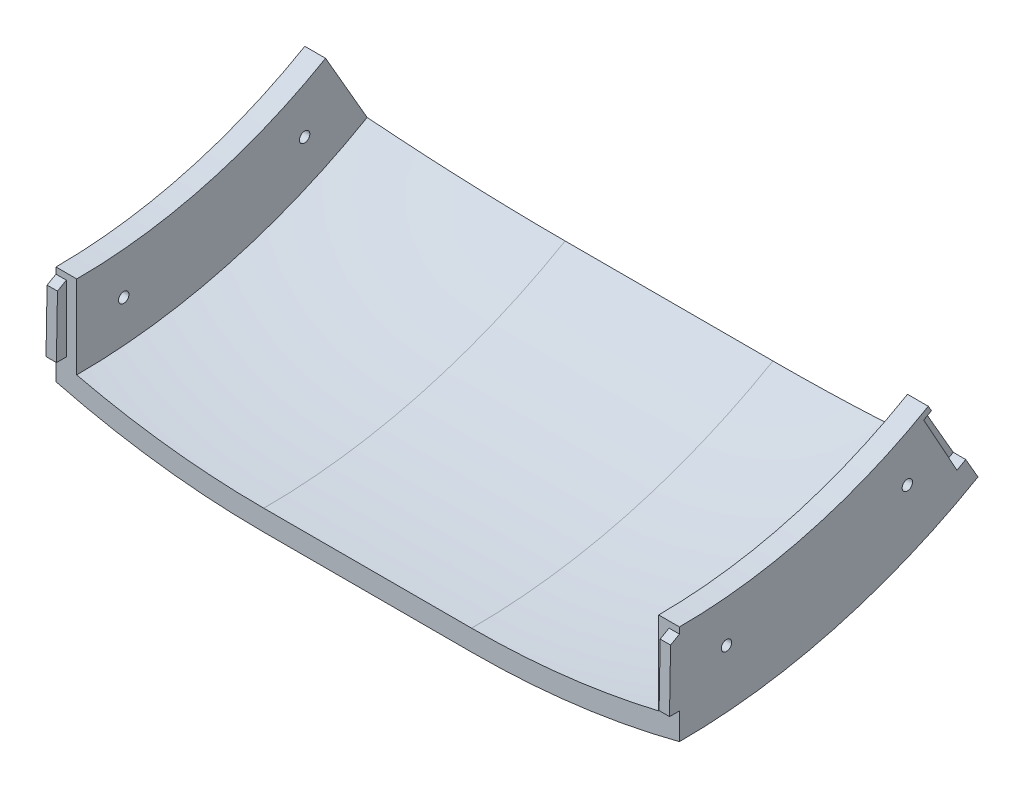
ISO-10303-21;
HEADER;
FILE_DESCRIPTION(('STEP AP214'),'2;1');
FILE_NAME('part.step','',(''),(''),'','','');
FILE_SCHEMA(('AUTOMOTIVE_DESIGN { 1 0 10303 214 1 1 1 1 }'));
ENDSEC;
DATA;
#1=APPLICATION_CONTEXT('core data for automotive mechanical design processes');
#2=APPLICATION_PROTOCOL_DEFINITION('international standard','automotive_design',2000,#1);
#3=PRODUCT_CONTEXT('',#1,'mechanical');
#4=PRODUCT('Part','Part','',(#3));
#5=PRODUCT_RELATED_PRODUCT_CATEGORY('part','',(#4));
#6=PRODUCT_DEFINITION_FORMATION('','',#4);
#7=PRODUCT_DEFINITION_CONTEXT('part definition',#1,'design');
#8=PRODUCT_DEFINITION('design','',#6,#7);
#9=PRODUCT_DEFINITION_SHAPE('','',#8);
#10=(LENGTH_UNIT() NAMED_UNIT(*) SI_UNIT(.MILLI.,.METRE.));
#11=(NAMED_UNIT(*) PLANE_ANGLE_UNIT() SI_UNIT($,.RADIAN.));
#12=(NAMED_UNIT(*) SI_UNIT($,.STERADIAN.) SOLID_ANGLE_UNIT());
#13=UNCERTAINTY_MEASURE_WITH_UNIT(LENGTH_MEASURE(1.E-05),#10,'distance_accuracy_value','');
#14=(GEOMETRIC_REPRESENTATION_CONTEXT(3) GLOBAL_UNCERTAINTY_ASSIGNED_CONTEXT((#13)) GLOBAL_UNIT_ASSIGNED_CONTEXT((#10,
#11,#12)) REPRESENTATION_CONTEXT('',''));
#15=CARTESIAN_POINT('',(0.,0.,0.));
#16=DIRECTION('',(0.,0.,1.));
#17=DIRECTION('',(1.,0.,0.));
#18=AXIS2_PLACEMENT_3D('',#15,#16,#17);
#19=CARTESIAN_POINT('',(50.,100.,0.));
#20=DIRECTION('',(0.,0.,1.));
#21=DIRECTION('',(1.,0.,0.));
#22=AXIS2_PLACEMENT_3D('',#19,#20,#21);
#23=PLANE('',#22);
#24=DIRECTION('',(0.,1.,0.));
#25=VECTOR('',#24,1.);
#26=CARTESIAN_POINT('',(-140.,-239.473319220206,0.));
#27=LINE('',#26,#25);
#28=CARTESIAN_POINT('',(-140.,-279.473319220206,0.));
#29=VERTEX_POINT('',#28);
#30=CARTESIAN_POINT('',(-140.,-239.473319220206,0.));
#31=VERTEX_POINT('',#30);
#32=EDGE_CURVE('E283',#29,#31,#27,.T.);
#33=ORIENTED_EDGE('',*,*,#32,.T.);
#34=DIRECTION('',(-1.,0.,0.));
#35=VECTOR('',#34,1.);
#36=CARTESIAN_POINT('',(-150.,-239.473319220206,0.));
#37=LINE('',#36,#35);
#38=CARTESIAN_POINT('',(-150.,-239.473319220206,0.));
#39=VERTEX_POINT('',#38);
#40=EDGE_CURVE('E286',#31,#39,#37,.T.);
#41=ORIENTED_EDGE('',*,*,#40,.T.);
#42=DIRECTION('',(0.,-1.,0.));
#43=VECTOR('',#42,1.);
#44=CARTESIAN_POINT('',(-150.,-287.298334620742,0.));
#45=LINE('',#44,#43);
#46=CARTESIAN_POINT('',(-150.,-242.473319220206,2.53977320767411E-12));
#47=VERTEX_POINT('',#46);
#48=EDGE_CURVE('E291',#39,#47,#45,.T.);
#49=ORIENTED_EDGE('',*,*,#48,.T.);
#50=DIRECTION('',(-1.,0.,0.));
#51=VECTOR('',#50,1.);
#52=CARTESIAN_POINT('',(-150.,-242.473319220206,0.));
#53=LINE('',#52,#51);
#54=CARTESIAN_POINT('',(-145.,-242.473319220206,2.53977320767411E-12));
#55=VERTEX_POINT('',#54);
#56=EDGE_CURVE('E443',#55,#47,#53,.T.);
#57=ORIENTED_EDGE('',*,*,#56,.F.);
#58=DIRECTION('',(0.,1.,0.));
#59=VECTOR('',#58,1.);
#60=CARTESIAN_POINT('',(-145.,-242.473319220206,0.));
#61=LINE('',#60,#59);
#62=CARTESIAN_POINT('',(-145.,-274.473319220206,0.));
#63=VERTEX_POINT('',#62);
#64=EDGE_CURVE('E439',#63,#55,#61,.T.);
#65=ORIENTED_EDGE('',*,*,#64,.F.);
#66=DIRECTION('',(1.,0.,0.));
#67=VECTOR('',#66,1.);
#68=CARTESIAN_POINT('',(-150.,-274.473319220206,0.));
#69=LINE('',#68,#67);
#70=CARTESIAN_POINT('',(-150.,-274.473319220206,0.));
#71=VERTEX_POINT('',#70);
#72=EDGE_CURVE('E393',#71,#63,#69,.T.);
#73=ORIENTED_EDGE('',*,*,#72,.F.);
#74=CARTESIAN_POINT('',(-150.,-287.298334620742,0.));
#75=VERTEX_POINT('',#74);
#76=EDGE_CURVE('E290',#71,#75,#45,.T.);
#77=ORIENTED_EDGE('',*,*,#76,.T.);
#78=CARTESIAN_POINT('',(-50.0000000000001,100.,0.));
#79=DIRECTION('',(0.,0.,1.));
#80=DIRECTION('',(-1.,0.,0.));
#81=AXIS2_PLACEMENT_3D('',#78,#79,#80);
#82=CIRCLE('',#81,400.);
#83=CARTESIAN_POINT('',(-50.,-300.,0.));
#84=VERTEX_POINT('',#83);
#85=EDGE_CURVE('E295',#75,#84,#82,.T.);
#86=ORIENTED_EDGE('',*,*,#85,.T.);
#87=DIRECTION('',(1.,0.,0.));
#88=VECTOR('',#87,1.);
#89=CARTESIAN_POINT('',(-50.,-300.,0.));
#90=LINE('',#89,#88);
#91=CARTESIAN_POINT('',(50.,-300.,0.));
#92=VERTEX_POINT('',#91);
#93=EDGE_CURVE('E299',#84,#92,#90,.T.);
#94=ORIENTED_EDGE('',*,*,#93,.T.);
#95=CARTESIAN_POINT('',(50.,100.,0.));
#96=DIRECTION('',(0.,0.,1.));
#97=DIRECTION('',(1.,0.,0.));
#98=AXIS2_PLACEMENT_3D('',#95,#96,#97);
#99=CIRCLE('',#98,400.);
#100=CARTESIAN_POINT('',(150.,-287.298334620742,0.));
#101=VERTEX_POINT('',#100);
#102=EDGE_CURVE('E255',#92,#101,#99,.T.);
#103=ORIENTED_EDGE('',*,*,#102,.T.);
#104=DIRECTION('',(0.,1.,0.));
#105=VECTOR('',#104,1.);
#106=CARTESIAN_POINT('',(150.,-287.298334620742,0.));
#107=LINE('',#106,#105);
#108=CARTESIAN_POINT('',(150.,-274.473319220205,0.));
#109=VERTEX_POINT('',#108);
#110=EDGE_CURVE('E254',#101,#109,#107,.T.);
#111=ORIENTED_EDGE('',*,*,#110,.T.);
#112=DIRECTION('',(1.,0.,0.));
#113=VECTOR('',#112,1.);
#114=CARTESIAN_POINT('',(150.,-274.473319220205,0.));
#115=LINE('',#114,#113);
#116=CARTESIAN_POINT('',(145.,-274.473319220205,0.));
#117=VERTEX_POINT('',#116);
#118=EDGE_CURVE('E419',#117,#109,#115,.T.);
#119=ORIENTED_EDGE('',*,*,#118,.F.);
#120=DIRECTION('',(0.,-1.,0.));
#121=VECTOR('',#120,1.);
#122=CARTESIAN_POINT('',(145.,-242.473319220206,0.));
#123=LINE('',#122,#121);
#124=CARTESIAN_POINT('',(145.,-242.473319220206,2.53977320767411E-12));
#125=VERTEX_POINT('',#124);
#126=EDGE_CURVE('E247',#125,#117,#123,.T.);
#127=ORIENTED_EDGE('',*,*,#126,.F.);
#128=DIRECTION('',(-1.,0.,0.));
#129=VECTOR('',#128,1.);
#130=CARTESIAN_POINT('',(150.,-242.473319220206,0.));
#131=LINE('',#130,#129);
#132=CARTESIAN_POINT('',(150.,-242.473319220206,2.53977320767411E-12));
#133=VERTEX_POINT('',#132);
#134=EDGE_CURVE('E231',#133,#125,#131,.T.);
#135=ORIENTED_EDGE('',*,*,#134,.F.);
#136=CARTESIAN_POINT('',(150.,-239.473319220205,0.));
#137=VERTEX_POINT('',#136);
#138=EDGE_CURVE('E243',#133,#137,#107,.T.);
#139=ORIENTED_EDGE('',*,*,#138,.T.);
#140=DIRECTION('',(-1.,0.,0.));
#141=VECTOR('',#140,1.);
#142=CARTESIAN_POINT('',(150.,-239.473319220205,0.));
#143=LINE('',#142,#141);
#144=CARTESIAN_POINT('',(140.,-239.473319220205,0.));
#145=VERTEX_POINT('',#144);
#146=EDGE_CURVE('E260',#137,#145,#143,.T.);
#147=ORIENTED_EDGE('',*,*,#146,.T.);
#148=DIRECTION('',(0.,-1.,0.));
#149=VECTOR('',#148,1.);
#150=CARTESIAN_POINT('',(140.,-239.473319220205,0.));
#151=LINE('',#150,#149);
#152=CARTESIAN_POINT('',(140.,-279.473319220205,0.));
#153=VERTEX_POINT('',#152);
#154=EDGE_CURVE('E268',#145,#153,#151,.T.);
#155=ORIENTED_EDGE('',*,*,#154,.T.);
#156=CARTESIAN_POINT('',(50.,100.,0.));
#157=DIRECTION('',(0.,0.,-1.));
#158=DIRECTION('',(1.,0.,0.));
#159=AXIS2_PLACEMENT_3D('',#156,#157,#158);
#160=CIRCLE('',#159,390.);
#161=CARTESIAN_POINT('',(50.,-290.,0.));
#162=VERTEX_POINT('',#161);
#163=EDGE_CURVE('E271',#153,#162,#160,.T.);
#164=ORIENTED_EDGE('',*,*,#163,.T.);
#165=DIRECTION('',(-1.,0.,0.));
#166=VECTOR('',#165,1.);
#167=CARTESIAN_POINT('',(50.,-290.,0.));
#168=LINE('',#167,#166);
#169=CARTESIAN_POINT('',(-50.,-290.,0.));
#170=VERTEX_POINT('',#169);
#171=EDGE_CURVE('E275',#162,#170,#168,.T.);
#172=ORIENTED_EDGE('',*,*,#171,.T.);
#173=CARTESIAN_POINT('',(-50.,100.,0.));
#174=DIRECTION('',(0.,0.,-1.));
#175=DIRECTION('',(-1.,0.,0.));
#176=AXIS2_PLACEMENT_3D('',#173,#174,#175);
#177=CIRCLE('',#176,390.);
#178=EDGE_CURVE('E279',#170,#29,#177,.T.);
#179=ORIENTED_EDGE('',*,*,#178,.T.);
#180=EDGE_LOOP('',(#33,#41,#49,#57,#65,#73,#77,#86,#94,#103,#111,#119,#127,#135,#139,#147,#155,
#164,#172,#179));
#181=FACE_BOUND('',#180,.T.);
#182=ADVANCED_FACE('F45',(#181),#23,.T.);
#183=CARTESIAN_POINT('',(50.,0.,0.));
#184=DIRECTION('',(-1.,0.,0.));
#185=DIRECTION('',(0.,0.,1.));
#186=AXIS2_PLACEMENT_3D('',#183,#184,#185);
#187=DEGENERATE_TOROIDAL_SURFACE('',#186,100.,400.,.F.);
#188=CARTESIAN_POINT('',(150.,0.,0.));
#189=DIRECTION('',(-1.,0.,0.));
#190=DIRECTION('',(0.,0.,1.));
#191=AXIS2_PLACEMENT_3D('',#188,#189,#190);
#192=CIRCLE('',#191,287.298334620742);
#193=CARTESIAN_POINT('',(150.,-248.807656246524,-143.649167310371));
#194=VERTEX_POINT('',#193);
#195=EDGE_CURVE('E11',#194,#101,#192,.T.);
#196=ORIENTED_EDGE('',*,*,#195,.T.);
#197=ORIENTED_EDGE('',*,*,#102,.F.);
#198=CARTESIAN_POINT('',(50.,0.,0.));
#199=DIRECTION('',(-1.,0.,0.));
#200=DIRECTION('',(0.,0.,1.));
#201=AXIS2_PLACEMENT_3D('',#198,#199,#200);
#202=CIRCLE('',#201,300.);
#203=CARTESIAN_POINT('',(50.,-259.807621135331,-150.));
#204=VERTEX_POINT('',#203);
#205=EDGE_CURVE('E353',#204,#92,#202,.T.);
#206=ORIENTED_EDGE('',*,*,#205,.F.);
#207=CARTESIAN_POINT('',(50.,86.6025403784438,50.0000000000001));
#208=DIRECTION('',(0.,-0.500000000000001,0.866025403784438));
#209=DIRECTION('',(1.,0.,0.));
#210=AXIS2_PLACEMENT_3D('',#207,#208,#209);
#211=CIRCLE('',#210,400.);
#212=EDGE_CURVE('E303',#204,#194,#211,.T.);
#213=ORIENTED_EDGE('',*,*,#212,.T.);
#214=EDGE_LOOP('',(#196,#197,#206,#213));
#215=FACE_BOUND('',#214,.T.);
#216=ADVANCED_FACE('F619',(#215),#187,.F.);
#217=CARTESIAN_POINT('',(150.,-248.807656246524,-143.649167310371));
#218=DIRECTION('',(1.,0.,0.));
#219=DIRECTION('',(0.,0.,-1.));
#220=AXIS2_PLACEMENT_3D('',#217,#218,#219);
#221=PLANE('',#220);
#222=CARTESIAN_POINT('',(150.,-258.482638313865,-22.6143005707349));
#223=DIRECTION('',(-1.,0.,0.));
#224=DIRECTION('',(0.,0.,1.));
#225=AXIS2_PLACEMENT_3D('',#222,#223,#224);
#226=CIRCLE('',#225,2.5);
#227=CARTESIAN_POINT('',(150.,-258.482638313865,-20.1143005707349));
#228=VERTEX_POINT('',#227);
#229=EDGE_CURVE('E896',#228,#228,#226,.T.);
#230=ORIENTED_EDGE('',*,*,#229,.T.);
#231=EDGE_LOOP('',(#230));
#232=FACE_BOUND('',#231,.T.);
#233=CARTESIAN_POINT('',(150.,-235.159681502399,-109.65676037386));
#234=DIRECTION('',(-1.,0.,0.));
#235=DIRECTION('',(0.,0.,1.));
#236=AXIS2_PLACEMENT_3D('',#233,#234,#235);
#237=CIRCLE('',#236,2.5);
#238=CARTESIAN_POINT('',(150.,-235.159681502399,-107.15676037386));
#239=VERTEX_POINT('',#238);
#240=EDGE_CURVE('E913',#239,#239,#237,.T.);
#241=ORIENTED_EDGE('',*,*,#240,.T.);
#242=EDGE_LOOP('',(#241));
#243=FACE_BOUND('',#242,.T.);
#244=DIRECTION('',(0.,-0.492423560103458,0.870355695939905));
#245=VECTOR('',#244,1.);
#246=CARTESIAN_POINT('',(150.,-242.473319220206,2.53977320767411E-12));
#247=LINE('',#246,#245);
#248=CARTESIAN_POINT('',(150.,-244.891772550725,4.27460179025921));
#249=VERTEX_POINT('',#248);
#250=EDGE_CURVE('E228',#133,#249,#247,.T.);
#251=ORIENTED_EDGE('',*,*,#250,.T.);
#252=DIRECTION('',(0.,0.999847695156391,-0.0174524064372835));
#253=VECTOR('',#252,1.);
#254=CARTESIAN_POINT('',(150.,-242.436389359242,4.23174291722822));
#255=LINE('',#254,#253);
#256=CARTESIAN_POINT('',(150.,-274.431515604247,4.7902199232213));
#257=VERTEX_POINT('',#256);
#258=EDGE_CURVE('E412',#257,#249,#255,.T.);
#259=ORIENTED_EDGE('',*,*,#258,.F.);
#260=CARTESIAN_POINT('',(150.,0.,0.));
#261=DIRECTION('',(1.,0.,0.));
#262=DIRECTION('',(0.,0.,-1.));
#263=AXIS2_PLACEMENT_3D('',#260,#261,#262);
#264=CIRCLE('',#263,274.473319220205);
#265=EDGE_CURVE('E410',#257,#109,#264,.T.);
#266=ORIENTED_EDGE('',*,*,#265,.T.);
#267=ORIENTED_EDGE('',*,*,#110,.F.);
#268=ORIENTED_EDGE('',*,*,#195,.F.);
#269=DIRECTION('',(0.,0.866025403784438,0.500000000000001));
#270=VECTOR('',#269,1.);
#271=CARTESIAN_POINT('',(150.,-248.807656246524,-143.649167310371));
#272=LINE('',#271,#270);
#273=CARTESIAN_POINT('',(150.,-238.566892509518,-137.736659610103));
#274=VERTEX_POINT('',#273);
#275=EDGE_CURVE('E308',#194,#274,#272,.T.);
#276=ORIENTED_EDGE('',*,*,#275,.T.);
#277=CARTESIAN_POINT('',(150.,0.,0.));
#278=DIRECTION('',(1.,0.,0.));
#279=DIRECTION('',(0.,1.,0.));
#280=AXIS2_PLACEMENT_3D('',#277,#278,#279);
#281=CIRCLE('',#280,275.473319220205);
#282=CARTESIAN_POINT('',(150.,-240.934393781093,-133.552115279146));
#283=VERTEX_POINT('',#282);
#284=EDGE_CURVE('E486',#283,#274,#281,.T.);
#285=ORIENTED_EDGE('',*,*,#284,.F.);
#286=DIRECTION('',(0.,-0.874619707139395,-0.484809620246338));
#287=VECTOR('',#286,1.);
#288=CARTESIAN_POINT('',(150.,-240.934393781093,-133.552115279146));
#289=LINE('',#288,#287);
#290=CARTESIAN_POINT('',(150.,-212.071943445493,-117.553397811017));
#291=VERTEX_POINT('',#290);
#292=EDGE_CURVE('E528',#291,#283,#289,.T.);
#293=ORIENTED_EDGE('',*,*,#292,.F.);
#294=CARTESIAN_POINT('',(150.,0.,0.));
#295=DIRECTION('',(1.,0.,0.));
#296=DIRECTION('',(0.,1.,0.));
#297=AXIS2_PLACEMENT_3D('',#294,#295,#296);
#298=CIRCLE('',#297,242.473319220205);
#299=CARTESIAN_POINT('',(150.,-209.988054184631,-121.236659610103));
#300=VERTEX_POINT('',#299);
#301=EDGE_CURVE('E543',#291,#300,#298,.T.);
#302=ORIENTED_EDGE('',*,*,#301,.T.);
#303=CARTESIAN_POINT('',(150.,-207.389977973278,-119.736659610103));
#304=VERTEX_POINT('',#303);
#305=EDGE_CURVE('E307',#300,#304,#272,.T.);
#306=ORIENTED_EDGE('',*,*,#305,.T.);
#307=CARTESIAN_POINT('',(150.,0.,0.));
#308=DIRECTION('',(-1.,0.,0.));
#309=DIRECTION('',(0.,0.,1.));
#310=AXIS2_PLACEMENT_3D('',#307,#308,#309);
#311=CIRCLE('',#310,239.473319220205);
#312=EDGE_CURVE('E54',#304,#137,#311,.T.);
#313=ORIENTED_EDGE('',*,*,#312,.T.);
#314=ORIENTED_EDGE('',*,*,#138,.F.);
#315=EDGE_LOOP('',(#251,#259,#266,#267,#268,#276,#285,#293,#302,#306,#313,#314));
#316=FACE_BOUND('',#315,.T.);
#317=ADVANCED_FACE('F47',(#232,#243,#316),#221,.T.);
#318=CARTESIAN_POINT('',(0.,0.,0.));
#319=DIRECTION('',(-1.,0.,0.));
#320=DIRECTION('',(0.,0.,1.));
#321=AXIS2_PLACEMENT_3D('',#318,#319,#320);
#322=CYLINDRICAL_SURFACE('',#321,239.473319220205);
#323=CARTESIAN_POINT('',(140.,0.,0.));
#324=DIRECTION('',(-1.,0.,0.));
#325=DIRECTION('',(0.,0.,1.));
#326=AXIS2_PLACEMENT_3D('',#323,#324,#325);
#327=CIRCLE('',#326,239.473319220205);
#328=CARTESIAN_POINT('',(140.,-207.389977973278,-119.736659610103));
#329=VERTEX_POINT('',#328);
#330=EDGE_CURVE('E383',#329,#145,#327,.T.);
#331=ORIENTED_EDGE('',*,*,#330,.T.);
#332=ORIENTED_EDGE('',*,*,#146,.F.);
#333=ORIENTED_EDGE('',*,*,#312,.F.);
#334=DIRECTION('',(-1.,0.,0.));
#335=VECTOR('',#334,1.);
#336=CARTESIAN_POINT('',(150.,-207.389977973278,-119.736659610103));
#337=LINE('',#336,#335);
#338=EDGE_CURVE('E312',#304,#329,#337,.T.);
#339=ORIENTED_EDGE('',*,*,#338,.T.);
#340=EDGE_LOOP('',(#331,#332,#333,#339));
#341=FACE_BOUND('',#340,.T.);
#342=ADVANCED_FACE('F581',(#341),#322,.F.);
#343=CARTESIAN_POINT('',(140.,-207.389977973278,-119.736659610103));
#344=DIRECTION('',(-1.,0.,0.));
#345=DIRECTION('',(0.,0.,1.));
#346=AXIS2_PLACEMENT_3D('',#343,#344,#345);
#347=PLANE('',#346);
#348=CARTESIAN_POINT('',(140.,-258.482638313865,-22.6143005707349));
#349=DIRECTION('',(-1.,0.,0.));
#350=DIRECTION('',(0.,0.,1.));
#351=AXIS2_PLACEMENT_3D('',#348,#349,#350);
#352=CIRCLE('',#351,2.5);
#353=CARTESIAN_POINT('',(140.,-258.482638313865,-20.1143005707349));
#354=VERTEX_POINT('',#353);
#355=EDGE_CURVE('E893',#354,#354,#352,.T.);
#356=ORIENTED_EDGE('',*,*,#355,.F.);
#357=EDGE_LOOP('',(#356));
#358=FACE_BOUND('',#357,.T.);
#359=CARTESIAN_POINT('',(140.,-235.159681502399,-109.65676037386));
#360=DIRECTION('',(-1.,0.,0.));
#361=DIRECTION('',(0.,0.,1.));
#362=AXIS2_PLACEMENT_3D('',#359,#360,#361);
#363=CIRCLE('',#362,2.5);
#364=CARTESIAN_POINT('',(140.,-235.159681502399,-107.15676037386));
#365=VERTEX_POINT('',#364);
#366=EDGE_CURVE('E904',#365,#365,#363,.T.);
#367=ORIENTED_EDGE('',*,*,#366,.F.);
#368=EDGE_LOOP('',(#367));
#369=FACE_BOUND('',#368,.T.);
#370=CARTESIAN_POINT('',(140.,0.,0.));
#371=DIRECTION('',(-1.,0.,0.));
#372=DIRECTION('',(0.,0.,1.));
#373=AXIS2_PLACEMENT_3D('',#370,#371,#372);
#374=CIRCLE('',#373,279.473319220205);
#375=CARTESIAN_POINT('',(140.,-242.030994124656,-139.736659610103));
#376=VERTEX_POINT('',#375);
#377=EDGE_CURVE('E379',#376,#153,#374,.T.);
#378=ORIENTED_EDGE('',*,*,#377,.T.);
#379=ORIENTED_EDGE('',*,*,#154,.F.);
#380=ORIENTED_EDGE('',*,*,#330,.F.);
#381=DIRECTION('',(0.,-0.866025403784438,-0.500000000000001));
#382=VECTOR('',#381,1.);
#383=CARTESIAN_POINT('',(140.,-207.389977973278,-119.736659610103));
#384=LINE('',#383,#382);
#385=EDGE_CURVE('E316',#329,#376,#384,.T.);
#386=ORIENTED_EDGE('',*,*,#385,.T.);
#387=EDGE_LOOP('',(#378,#379,#380,#386));
#388=FACE_BOUND('',#387,.T.);
#389=ADVANCED_FACE('F584',(#358,#369,#388),#347,.T.);
#390=CARTESIAN_POINT('',(50.,0.,0.));
#391=DIRECTION('',(-1.,0.,0.));
#392=DIRECTION('',(0.,0.,1.));
#393=AXIS2_PLACEMENT_3D('',#390,#391,#392);
#394=DEGENERATE_TOROIDAL_SURFACE('',#393,100.,390.,.F.);
#395=CARTESIAN_POINT('',(50.,0.,0.));
#396=DIRECTION('',(-1.,0.,0.));
#397=DIRECTION('',(0.,0.,1.));
#398=AXIS2_PLACEMENT_3D('',#395,#396,#397);
#399=CIRCLE('',#398,290.);
#400=CARTESIAN_POINT('',(50.,-251.147367097487,-145.));
#401=VERTEX_POINT('',#400);
#402=EDGE_CURVE('E376',#401,#162,#399,.T.);
#403=ORIENTED_EDGE('',*,*,#402,.T.);
#404=ORIENTED_EDGE('',*,*,#163,.F.);
#405=ORIENTED_EDGE('',*,*,#377,.F.);
#406=CARTESIAN_POINT('',(50.,86.6025403784438,50.0000000000001));
#407=DIRECTION('',(0.,0.500000000000001,-0.866025403784438));
#408=DIRECTION('',(1.,0.,0.));
#409=AXIS2_PLACEMENT_3D('',#406,#407,#408);
#410=CIRCLE('',#409,390.);
#411=EDGE_CURVE('E320',#376,#401,#410,.T.);
#412=ORIENTED_EDGE('',*,*,#411,.T.);
#413=EDGE_LOOP('',(#403,#404,#405,#412));
#414=FACE_BOUND('',#413,.T.);
#415=ADVANCED_FACE('F587',(#414),#394,.T.);
#416=CARTESIAN_POINT('',(0.,0.,0.));
#417=DIRECTION('',(-1.,0.,0.));
#418=DIRECTION('',(0.,0.,1.));
#419=AXIS2_PLACEMENT_3D('',#416,#417,#418);
#420=CYLINDRICAL_SURFACE('',#419,290.);
#421=CARTESIAN_POINT('',(-50.,0.,0.));
#422=DIRECTION('',(-1.,0.,0.));
#423=DIRECTION('',(0.,0.,1.));
#424=AXIS2_PLACEMENT_3D('',#421,#422,#423);
#425=CIRCLE('',#424,290.);
#426=CARTESIAN_POINT('',(-50.,-251.147367097487,-145.));
#427=VERTEX_POINT('',#426);
#428=EDGE_CURVE('E373',#427,#170,#425,.T.);
#429=ORIENTED_EDGE('',*,*,#428,.T.);
#430=ORIENTED_EDGE('',*,*,#171,.F.);
#431=ORIENTED_EDGE('',*,*,#402,.F.);
#432=DIRECTION('',(-1.,0.,0.));
#433=VECTOR('',#432,1.);
#434=CARTESIAN_POINT('',(50.,-251.147367097487,-145.));
#435=LINE('',#434,#433);
#436=EDGE_CURVE('E324',#401,#427,#435,.T.);
#437=ORIENTED_EDGE('',*,*,#436,.T.);
#438=EDGE_LOOP('',(#429,#430,#431,#437));
#439=FACE_BOUND('',#438,.T.);
#440=ADVANCED_FACE('F591',(#439),#420,.F.);
#441=CARTESIAN_POINT('',(-50.,0.,0.));
#442=DIRECTION('',(-1.,0.,0.));
#443=DIRECTION('',(0.,0.,1.));
#444=AXIS2_PLACEMENT_3D('',#441,#442,#443);
#445=DEGENERATE_TOROIDAL_SURFACE('',#444,100.,390.,.F.);
#446=CARTESIAN_POINT('',(-140.,0.,0.));
#447=DIRECTION('',(-1.,0.,0.));
#448=DIRECTION('',(0.,0.,1.));
#449=AXIS2_PLACEMENT_3D('',#446,#447,#448);
#450=CIRCLE('',#449,279.473319220205);
#451=CARTESIAN_POINT('',(-140.,-242.030994124656,-139.736659610103));
#452=VERTEX_POINT('',#451);
#453=EDGE_CURVE('E370',#452,#29,#450,.T.);
#454=ORIENTED_EDGE('',*,*,#453,.T.);
#455=ORIENTED_EDGE('',*,*,#178,.F.);
#456=ORIENTED_EDGE('',*,*,#428,.F.);
#457=CARTESIAN_POINT('',(-50.,86.6025403784438,50.0000000000001));
#458=DIRECTION('',(0.,0.500000000000001,-0.866025403784438));
#459=DIRECTION('',(-1.,0.,0.));
#460=AXIS2_PLACEMENT_3D('',#457,#458,#459);
#461=CIRCLE('',#460,390.);
#462=EDGE_CURVE('E328',#427,#452,#461,.T.);
#463=ORIENTED_EDGE('',*,*,#462,.T.);
#464=EDGE_LOOP('',(#454,#455,#456,#463));
#465=FACE_BOUND('',#464,.T.);
#466=ADVANCED_FACE('F595',(#465),#445,.T.);
#467=CARTESIAN_POINT('',(-140.,-207.389977973278,-119.736659610103));
#468=DIRECTION('',(1.,0.,0.));
#469=DIRECTION('',(0.,0.,-1.));
#470=AXIS2_PLACEMENT_3D('',#467,#468,#469);
#471=PLANE('',#470);
#472=CARTESIAN_POINT('',(-140.,-258.482638313865,-22.6143005707349));
#473=DIRECTION('',(1.,0.,0.));
#474=DIRECTION('',(0.,0.,-1.));
#475=AXIS2_PLACEMENT_3D('',#472,#473,#474);
#476=CIRCLE('',#475,2.5);
#477=CARTESIAN_POINT('',(-140.,-258.482638313865,-25.1143005707349));
#478=VERTEX_POINT('',#477);
#479=EDGE_CURVE('E920',#478,#478,#476,.T.);
#480=ORIENTED_EDGE('',*,*,#479,.F.);
#481=EDGE_LOOP('',(#480));
#482=FACE_BOUND('',#481,.T.);
#483=CARTESIAN_POINT('',(-140.,-235.159681502399,-109.65676037386));
#484=DIRECTION('',(1.,0.,0.));
#485=DIRECTION('',(0.,0.,-1.));
#486=AXIS2_PLACEMENT_3D('',#483,#484,#485);
#487=CIRCLE('',#486,2.5);
#488=CARTESIAN_POINT('',(-140.,-235.159681502399,-112.15676037386));
#489=VERTEX_POINT('',#488);
#490=EDGE_CURVE('E898',#489,#489,#487,.T.);
#491=ORIENTED_EDGE('',*,*,#490,.F.);
#492=EDGE_LOOP('',(#491));
#493=FACE_BOUND('',#492,.T.);
#494=CARTESIAN_POINT('',(-140.,0.,0.));
#495=DIRECTION('',(-1.,0.,0.));
#496=DIRECTION('',(0.,0.,1.));
#497=AXIS2_PLACEMENT_3D('',#494,#495,#496);
#498=CIRCLE('',#497,239.473319220206);
#499=CARTESIAN_POINT('',(-140.,-207.389977973278,-119.736659610103));
#500=VERTEX_POINT('',#499);
#501=EDGE_CURVE('E366',#500,#31,#498,.T.);
#502=ORIENTED_EDGE('',*,*,#501,.T.);
#503=ORIENTED_EDGE('',*,*,#32,.F.);
#504=ORIENTED_EDGE('',*,*,#453,.F.);
#505=DIRECTION('',(0.,0.866025403784438,0.500000000000001));
#506=VECTOR('',#505,1.);
#507=CARTESIAN_POINT('',(-140.,-207.389977973278,-119.736659610103));
#508=LINE('',#507,#506);
#509=EDGE_CURVE('E332',#452,#500,#508,.T.);
#510=ORIENTED_EDGE('',*,*,#509,.T.);
#511=EDGE_LOOP('',(#502,#503,#504,#510));
#512=FACE_BOUND('',#511,.T.);
#513=ADVANCED_FACE('F599',(#482,#493,#512),#471,.T.);
#514=CARTESIAN_POINT('',(0.,0.,0.));
#515=DIRECTION('',(-1.,0.,0.));
#516=DIRECTION('',(0.,0.,1.));
#517=AXIS2_PLACEMENT_3D('',#514,#515,#516);
#518=CYLINDRICAL_SURFACE('',#517,239.473319220206);
#519=CARTESIAN_POINT('',(-150.,0.,0.));
#520=DIRECTION('',(-1.,0.,0.));
#521=DIRECTION('',(0.,0.,1.));
#522=AXIS2_PLACEMENT_3D('',#519,#520,#521);
#523=CIRCLE('',#522,239.473319220206);
#524=CARTESIAN_POINT('',(-150.,-207.389977973278,-119.736659610103));
#525=VERTEX_POINT('',#524);
#526=EDGE_CURVE('E363',#525,#39,#523,.T.);
#527=ORIENTED_EDGE('',*,*,#526,.T.);
#528=ORIENTED_EDGE('',*,*,#40,.F.);
#529=ORIENTED_EDGE('',*,*,#501,.F.);
#530=DIRECTION('',(-1.,0.,0.));
#531=VECTOR('',#530,1.);
#532=CARTESIAN_POINT('',(-150.,-207.389977973278,-119.736659610103));
#533=LINE('',#532,#531);
#534=EDGE_CURVE('E336',#500,#525,#533,.T.);
#535=ORIENTED_EDGE('',*,*,#534,.T.);
#536=EDGE_LOOP('',(#527,#528,#529,#535));
#537=FACE_BOUND('',#536,.T.);
#538=ADVANCED_FACE('F603',(#537),#518,.F.);
#539=CARTESIAN_POINT('',(-150.,-248.807656246524,-143.649167310371));
#540=DIRECTION('',(-1.,0.,0.));
#541=DIRECTION('',(0.,0.,1.));
#542=AXIS2_PLACEMENT_3D('',#539,#540,#541);
#543=PLANE('',#542);
#544=CARTESIAN_POINT('',(-150.,-258.482638313865,-22.6143005707349));
#545=DIRECTION('',(-1.,0.,0.));
#546=DIRECTION('',(0.,0.,1.));
#547=AXIS2_PLACEMENT_3D('',#544,#545,#546);
#548=CIRCLE('',#547,2.5);
#549=CARTESIAN_POINT('',(-150.,-258.482638313865,-20.1143005707349));
#550=VERTEX_POINT('',#549);
#551=EDGE_CURVE('E899',#550,#550,#548,.T.);
#552=ORIENTED_EDGE('',*,*,#551,.F.);
#553=EDGE_LOOP('',(#552));
#554=FACE_BOUND('',#553,.T.);
#555=CARTESIAN_POINT('',(-150.,-235.159681502399,-109.65676037386));
#556=DIRECTION('',(-1.,0.,0.));
#557=DIRECTION('',(0.,0.,1.));
#558=AXIS2_PLACEMENT_3D('',#555,#556,#557);
#559=CIRCLE('',#558,2.5);
#560=CARTESIAN_POINT('',(-150.,-235.159681502399,-107.15676037386));
#561=VERTEX_POINT('',#560);
#562=EDGE_CURVE('E907',#561,#561,#559,.T.);
#563=ORIENTED_EDGE('',*,*,#562,.F.);
#564=EDGE_LOOP('',(#563));
#565=FACE_BOUND('',#564,.T.);
#566=DIRECTION('',(0.,-0.492423560103458,0.870355695939905));
#567=VECTOR('',#566,1.);
#568=CARTESIAN_POINT('',(-150.,-242.473319220206,2.53977320767411E-12));
#569=LINE('',#568,#567);
#570=CARTESIAN_POINT('',(-150.,-244.891772550725,4.27460179025921));
#571=VERTEX_POINT('',#570);
#572=EDGE_CURVE('E61',#47,#571,#569,.T.);
#573=ORIENTED_EDGE('',*,*,#572,.F.);
#574=ORIENTED_EDGE('',*,*,#48,.F.);
#575=ORIENTED_EDGE('',*,*,#526,.F.);
#576=DIRECTION('',(0.,-0.866025403784438,-0.500000000000001));
#577=VECTOR('',#576,1.);
#578=CARTESIAN_POINT('',(-150.,-248.807656246524,-143.649167310371));
#579=LINE('',#578,#577);
#580=CARTESIAN_POINT('',(-150.,-209.988054184631,-121.236659610103));
#581=VERTEX_POINT('',#580);
#582=EDGE_CURVE('E341',#525,#581,#579,.T.);
#583=ORIENTED_EDGE('',*,*,#582,.T.);
#584=CARTESIAN_POINT('',(-150.,0.,0.));
#585=DIRECTION('',(1.,0.,0.));
#586=DIRECTION('',(0.,1.,0.));
#587=AXIS2_PLACEMENT_3D('',#584,#585,#586);
#588=CIRCLE('',#587,242.473319220206);
#589=CARTESIAN_POINT('',(-150.,-212.071943445493,-117.553397811017));
#590=VERTEX_POINT('',#589);
#591=EDGE_CURVE('E249',#590,#581,#588,.T.);
#592=ORIENTED_EDGE('',*,*,#591,.F.);
#593=DIRECTION('',(0.,0.874619707139395,0.484809620246338));
#594=VECTOR('',#593,1.);
#595=CARTESIAN_POINT('',(-150.,-240.934393781093,-133.552115279146));
#596=LINE('',#595,#594);
#597=CARTESIAN_POINT('',(-150.,-240.934393781093,-133.552115279146));
#598=VERTEX_POINT('',#597);
#599=EDGE_CURVE('E492',#598,#590,#596,.T.);
#600=ORIENTED_EDGE('',*,*,#599,.F.);
#601=CARTESIAN_POINT('',(-150.,0.,0.));
#602=DIRECTION('',(1.,0.,0.));
#603=DIRECTION('',(0.,1.,0.));
#604=AXIS2_PLACEMENT_3D('',#601,#602,#603);
#605=CIRCLE('',#604,275.473319220206);
#606=CARTESIAN_POINT('',(-150.,-238.566892509518,-137.736659610103));
#607=VERTEX_POINT('',#606);
#608=EDGE_CURVE('E507',#598,#607,#605,.T.);
#609=ORIENTED_EDGE('',*,*,#608,.T.);
#610=CARTESIAN_POINT('',(-150.,-248.807656246524,-143.649167310371));
#611=VERTEX_POINT('',#610);
#612=EDGE_CURVE('E340',#607,#611,#579,.T.);
#613=ORIENTED_EDGE('',*,*,#612,.T.);
#614=CARTESIAN_POINT('',(-150.,0.,0.));
#615=DIRECTION('',(-1.,0.,0.));
#616=DIRECTION('',(0.,0.,1.));
#617=AXIS2_PLACEMENT_3D('',#614,#615,#616);
#618=CIRCLE('',#617,287.298334620742);
#619=EDGE_CURVE('E359',#611,#75,#618,.T.);
#620=ORIENTED_EDGE('',*,*,#619,.T.);
#621=ORIENTED_EDGE('',*,*,#76,.F.);
#622=CARTESIAN_POINT('',(-150.,0.,0.));
#623=DIRECTION('',(1.,0.,0.));
#624=DIRECTION('',(0.,0.,-1.));
#625=AXIS2_PLACEMENT_3D('',#622,#623,#624);
#626=CIRCLE('',#625,274.473319220206);
#627=CARTESIAN_POINT('',(-150.,-274.431515604247,4.7902199232213));
#628=VERTEX_POINT('',#627);
#629=EDGE_CURVE('E262',#628,#71,#626,.T.);
#630=ORIENTED_EDGE('',*,*,#629,.F.);
#631=DIRECTION('',(0.,-0.999847695156391,0.0174524064372835));
#632=VECTOR('',#631,1.);
#633=CARTESIAN_POINT('',(-150.,-242.436389359242,4.23174291722822));
#634=LINE('',#633,#632);
#635=EDGE_CURVE('E446',#571,#628,#634,.T.);
#636=ORIENTED_EDGE('',*,*,#635,.F.);
#637=EDGE_LOOP('',(#573,#574,#575,#583,#592,#600,#609,#613,#620,#621,#630,#636));
#638=FACE_BOUND('',#637,.T.);
#639=ADVANCED_FACE('F398',(#554,#565,#638),#543,.T.);
#640=CARTESIAN_POINT('',(-50.0000000000001,0.,0.));
#641=DIRECTION('',(-1.,0.,0.));
#642=DIRECTION('',(0.,0.,1.));
#643=AXIS2_PLACEMENT_3D('',#640,#641,#642);
#644=DEGENERATE_TOROIDAL_SURFACE('',#643,100.,400.,.F.);
#645=CARTESIAN_POINT('',(-50.,0.,0.));
#646=DIRECTION('',(-1.,0.,0.));
#647=DIRECTION('',(0.,0.,1.));
#648=AXIS2_PLACEMENT_3D('',#645,#646,#647);
#649=CIRCLE('',#648,300.);
#650=CARTESIAN_POINT('',(-50.,-259.807621135331,-150.));
#651=VERTEX_POINT('',#650);
#652=EDGE_CURVE('E356',#651,#84,#649,.T.);
#653=ORIENTED_EDGE('',*,*,#652,.T.);
#654=ORIENTED_EDGE('',*,*,#85,.F.);
#655=ORIENTED_EDGE('',*,*,#619,.F.);
#656=CARTESIAN_POINT('',(-50.0000000000001,86.6025403784438,50.0000000000001));
#657=DIRECTION('',(0.,-0.500000000000001,0.866025403784438));
#658=DIRECTION('',(-1.,0.,0.));
#659=AXIS2_PLACEMENT_3D('',#656,#657,#658);
#660=CIRCLE('',#659,400.);
#661=EDGE_CURVE('E345',#611,#651,#660,.T.);
#662=ORIENTED_EDGE('',*,*,#661,.T.);
#663=EDGE_LOOP('',(#653,#654,#655,#662));
#664=FACE_BOUND('',#663,.T.);
#665=ADVANCED_FACE('F403',(#664),#644,.F.);
#666=CARTESIAN_POINT('',(0.,0.,0.));
#667=DIRECTION('',(-1.,0.,0.));
#668=DIRECTION('',(0.,0.,1.));
#669=AXIS2_PLACEMENT_3D('',#666,#667,#668);
#670=CYLINDRICAL_SURFACE('',#669,300.);
#671=DIRECTION('',(1.,0.,0.));
#672=VECTOR('',#671,1.);
#673=CARTESIAN_POINT('',(-50.,-259.807621135331,-150.));
#674=LINE('',#673,#672);
#675=EDGE_CURVE('E349',#651,#204,#674,.T.);
#676=ORIENTED_EDGE('',*,*,#675,.T.);
#677=ORIENTED_EDGE('',*,*,#205,.T.);
#678=ORIENTED_EDGE('',*,*,#93,.F.);
#679=ORIENTED_EDGE('',*,*,#652,.F.);
#680=EDGE_LOOP('',(#676,#677,#678,#679));
#681=FACE_BOUND('',#680,.T.);
#682=ADVANCED_FACE('F406',(#681),#670,.T.);
#683=CARTESIAN_POINT('',(50.,86.6025403784438,50.0000000000001));
#684=DIRECTION('',(0.,-0.500000000000001,0.866025403784438));
#685=DIRECTION('',(1.,0.,0.));
#686=AXIS2_PLACEMENT_3D('',#683,#684,#685);
#687=PLANE('',#686);
#688=DIRECTION('',(0.,-0.866025403784438,-0.500000000000001));
#689=VECTOR('',#688,1.);
#690=CARTESIAN_POINT('',(-144.,-238.566892509518,-137.736659610103));
#691=LINE('',#690,#689);
#692=CARTESIAN_POINT('',(-144.,-209.988054184631,-121.236659610103));
#693=VERTEX_POINT('',#692);
#694=CARTESIAN_POINT('',(-144.,-238.566892509518,-137.736659610103));
#695=VERTEX_POINT('',#694);
#696=EDGE_CURVE('E485',#693,#695,#691,.T.);
#697=ORIENTED_EDGE('',*,*,#696,.F.);
#698=DIRECTION('',(1.,0.,0.));
#699=VECTOR('',#698,1.);
#700=CARTESIAN_POINT('',(-150.,-209.988054184631,-121.236659610103));
#701=LINE('',#700,#699);
#702=EDGE_CURVE('E481',#581,#693,#701,.T.);
#703=ORIENTED_EDGE('',*,*,#702,.F.);
#704=ORIENTED_EDGE('',*,*,#582,.F.);
#705=ORIENTED_EDGE('',*,*,#534,.F.);
#706=ORIENTED_EDGE('',*,*,#509,.F.);
#707=ORIENTED_EDGE('',*,*,#462,.F.);
#708=ORIENTED_EDGE('',*,*,#436,.F.);
#709=ORIENTED_EDGE('',*,*,#411,.F.);
#710=ORIENTED_EDGE('',*,*,#385,.F.);
#711=ORIENTED_EDGE('',*,*,#338,.F.);
#712=ORIENTED_EDGE('',*,*,#305,.F.);
#713=DIRECTION('',(1.,0.,0.));
#714=VECTOR('',#713,1.);
#715=CARTESIAN_POINT('',(150.,-209.988054184631,-121.236659610103));
#716=LINE('',#715,#714);
#717=CARTESIAN_POINT('',(144.,-209.988054184631,-121.236659610103));
#718=VERTEX_POINT('',#717);
#719=EDGE_CURVE('E525',#718,#300,#716,.T.);
#720=ORIENTED_EDGE('',*,*,#719,.F.);
#721=DIRECTION('',(0.,0.866025403784438,0.500000000000001));
#722=VECTOR('',#721,1.);
#723=CARTESIAN_POINT('',(144.,-238.566892509518,-137.736659610103));
#724=LINE('',#723,#722);
#725=CARTESIAN_POINT('',(144.,-238.566892509518,-137.736659610103));
#726=VERTEX_POINT('',#725);
#727=EDGE_CURVE('E522',#726,#718,#724,.T.);
#728=ORIENTED_EDGE('',*,*,#727,.F.);
#729=DIRECTION('',(-1.,0.,0.));
#730=VECTOR('',#729,1.);
#731=CARTESIAN_POINT('',(150.,-238.566892509518,-137.736659610103));
#732=LINE('',#731,#730);
#733=EDGE_CURVE('E480',#274,#726,#732,.T.);
#734=ORIENTED_EDGE('',*,*,#733,.F.);
#735=ORIENTED_EDGE('',*,*,#275,.F.);
#736=ORIENTED_EDGE('',*,*,#212,.F.);
#737=ORIENTED_EDGE('',*,*,#675,.F.);
#738=ORIENTED_EDGE('',*,*,#661,.F.);
#739=ORIENTED_EDGE('',*,*,#612,.F.);
#740=DIRECTION('',(-1.,0.,0.));
#741=VECTOR('',#740,1.);
#742=CARTESIAN_POINT('',(-150.,-238.566892509518,-137.736659610103));
#743=LINE('',#742,#741);
#744=EDGE_CURVE('E489',#695,#607,#743,.T.);
#745=ORIENTED_EDGE('',*,*,#744,.F.);
#746=EDGE_LOOP('',(#697,#703,#704,#705,#706,#707,#708,#709,#710,#711,#712,#720,#728,#734,#735,
#736,#737,#738,#739,#745));
#747=FACE_BOUND('',#746,.T.);
#748=ADVANCED_FACE('F565',(#747),#687,.F.);
#749=CARTESIAN_POINT('',(-163.497361966257,0.,0.));
#750=DIRECTION('',(1.,0.,0.));
#751=DIRECTION('',(0.,0.,-1.));
#752=AXIS2_PLACEMENT_3D('',#749,#750,#751);
#753=CYLINDRICAL_SURFACE('',#752,274.473319220206);
#754=CARTESIAN_POINT('',(-145.,0.,0.));
#755=DIRECTION('',(1.,0.,0.));
#756=DIRECTION('',(0.,0.,-1.));
#757=AXIS2_PLACEMENT_3D('',#754,#755,#756);
#758=CIRCLE('',#757,274.473319220206);
#759=CARTESIAN_POINT('',(-145.,-274.431515604247,4.7902199232213));
#760=VERTEX_POINT('',#759);
#761=EDGE_CURVE('E457',#760,#63,#758,.T.);
#762=ORIENTED_EDGE('',*,*,#761,.F.);
#763=DIRECTION('',(1.,0.,0.));
#764=VECTOR('',#763,1.);
#765=CARTESIAN_POINT('',(-150.,-274.431515604247,4.7902199232213));
#766=LINE('',#765,#764);
#767=EDGE_CURVE('E449',#628,#760,#766,.T.);
#768=ORIENTED_EDGE('',*,*,#767,.F.);
#769=ORIENTED_EDGE('',*,*,#629,.T.);
#770=ORIENTED_EDGE('',*,*,#72,.T.);
#771=EDGE_LOOP('',(#762,#768,#769,#770));
#772=FACE_BOUND('',#771,.T.);
#773=ADVANCED_FACE('F463',(#772),#753,.T.);
#774=CARTESIAN_POINT('',(-145.,-242.436389359242,4.23174291722822));
#775=DIRECTION('',(-1.,0.,0.));
#776=DIRECTION('',(0.,0.,1.));
#777=AXIS2_PLACEMENT_3D('',#774,#775,#776);
#778=PLANE('',#777);
#779=ORIENTED_EDGE('',*,*,#64,.T.);
#780=DIRECTION('',(0.,-0.492423560103458,0.870355695939905));
#781=VECTOR('',#780,1.);
#782=CARTESIAN_POINT('',(-145.,-244.278020258784,3.18979828679797));
#783=LINE('',#782,#781);
#784=CARTESIAN_POINT('',(-145.,-244.891772550725,4.27460179025921));
#785=VERTEX_POINT('',#784);
#786=EDGE_CURVE('E477',#55,#785,#783,.T.);
#787=ORIENTED_EDGE('',*,*,#786,.T.);
#788=DIRECTION('',(0.,0.999847695156391,-0.0174524064372835));
#789=VECTOR('',#788,1.);
#790=CARTESIAN_POINT('',(-145.,-242.436389359242,4.23174291722822));
#791=LINE('',#790,#789);
#792=EDGE_CURVE('E453',#760,#785,#791,.T.);
#793=ORIENTED_EDGE('',*,*,#792,.F.);
#794=ORIENTED_EDGE('',*,*,#761,.T.);
#795=EDGE_LOOP('',(#779,#787,#793,#794));
#796=FACE_BOUND('',#795,.T.);
#797=ADVANCED_FACE('F695',(#796),#778,.F.);
#798=CARTESIAN_POINT('',(0.,0.,0.));
#799=DIRECTION('',(0.,0.0174524064372835,0.999847695156391));
#800=DIRECTION('',(1.,0.,0.));
#801=AXIS2_PLACEMENT_3D('',#798,#799,#800);
#802=PLANE('',#801);
#803=DIRECTION('',(-1.,0.,0.));
#804=VECTOR('',#803,1.);
#805=CARTESIAN_POINT('',(150.,-244.891772550725,4.27460179025921));
#806=LINE('',#805,#804);
#807=EDGE_CURVE('E238',#785,#571,#806,.T.);
#808=ORIENTED_EDGE('',*,*,#807,.T.);
#809=ORIENTED_EDGE('',*,*,#635,.T.);
#810=ORIENTED_EDGE('',*,*,#767,.T.);
#811=ORIENTED_EDGE('',*,*,#792,.T.);
#812=EDGE_LOOP('',(#808,#809,#810,#811));
#813=FACE_BOUND('',#812,.T.);
#814=ADVANCED_FACE('F467',(#813),#802,.T.);
#815=CARTESIAN_POINT('',(-163.497361966257,0.,0.));
#816=DIRECTION('',(1.,0.,0.));
#817=DIRECTION('',(0.,0.,-1.));
#818=AXIS2_PLACEMENT_3D('',#815,#816,#817);
#819=CYLINDRICAL_SURFACE('',#818,274.473319220205);
#820=CARTESIAN_POINT('',(145.,0.,0.));
#821=DIRECTION('',(1.,0.,0.));
#822=DIRECTION('',(0.,0.,-1.));
#823=AXIS2_PLACEMENT_3D('',#820,#821,#822);
#824=CIRCLE('',#823,274.473319220205);
#825=CARTESIAN_POINT('',(145.,-274.431515604247,4.7902199232213));
#826=VERTEX_POINT('',#825);
#827=EDGE_CURVE('E417',#826,#117,#824,.T.);
#828=ORIENTED_EDGE('',*,*,#827,.T.);
#829=ORIENTED_EDGE('',*,*,#118,.T.);
#830=ORIENTED_EDGE('',*,*,#265,.F.);
#831=DIRECTION('',(1.,0.,0.));
#832=VECTOR('',#831,1.);
#833=CARTESIAN_POINT('',(150.,-274.431515604247,4.7902199232213));
#834=LINE('',#833,#832);
#835=EDGE_CURVE('E432',#826,#257,#834,.T.);
#836=ORIENTED_EDGE('',*,*,#835,.F.);
#837=EDGE_LOOP('',(#828,#829,#830,#836));
#838=FACE_BOUND('',#837,.T.);
#839=ADVANCED_FACE('F420',(#838),#819,.T.);
#840=CARTESIAN_POINT('',(145.,-242.436389359242,4.23174291722822));
#841=DIRECTION('',(1.,0.,0.));
#842=DIRECTION('',(0.,0.,-1.));
#843=AXIS2_PLACEMENT_3D('',#840,#841,#842);
#844=PLANE('',#843);
#845=DIRECTION('',(0.,-0.999847695156391,0.0174524064372835));
#846=VECTOR('',#845,1.);
#847=CARTESIAN_POINT('',(145.,-242.436389359242,4.23174291722822));
#848=LINE('',#847,#846);
#849=CARTESIAN_POINT('',(145.,-244.891772550725,4.27460179025921));
#850=VERTEX_POINT('',#849);
#851=EDGE_CURVE('E426',#850,#826,#848,.T.);
#852=ORIENTED_EDGE('',*,*,#851,.F.);
#853=DIRECTION('',(0.,0.492423560103458,-0.870355695939905));
#854=VECTOR('',#853,1.);
#855=CARTESIAN_POINT('',(145.,-244.278020258784,3.18979828679796));
#856=LINE('',#855,#854);
#857=EDGE_CURVE('E69',#850,#125,#856,.T.);
#858=ORIENTED_EDGE('',*,*,#857,.T.);
#859=ORIENTED_EDGE('',*,*,#126,.T.);
#860=ORIENTED_EDGE('',*,*,#827,.F.);
#861=EDGE_LOOP('',(#852,#858,#859,#860));
#862=FACE_BOUND('',#861,.T.);
#863=ADVANCED_FACE('F705',(#862),#844,.F.);
#864=CARTESIAN_POINT('',(0.,0.,0.));
#865=DIRECTION('',(0.,-0.0174524064372835,-0.999847695156391));
#866=DIRECTION('',(-1.,0.,0.));
#867=AXIS2_PLACEMENT_3D('',#864,#865,#866);
#868=PLANE('',#867);
#869=ORIENTED_EDGE('',*,*,#258,.T.);
#870=EDGE_CURVE('E232',#249,#850,#806,.T.);
#871=ORIENTED_EDGE('',*,*,#870,.T.);
#872=ORIENTED_EDGE('',*,*,#851,.T.);
#873=ORIENTED_EDGE('',*,*,#835,.T.);
#874=EDGE_LOOP('',(#869,#871,#872,#873));
#875=FACE_BOUND('',#874,.T.);
#876=ADVANCED_FACE('F721',(#875),#868,.F.);
#877=CARTESIAN_POINT('',(-66.7687408164903,0.,0.));
#878=DIRECTION('',(1.,0.,0.));
#879=DIRECTION('',(0.,1.,0.));
#880=AXIS2_PLACEMENT_3D('',#877,#878,#879);
#881=CYLINDRICAL_SURFACE('',#880,275.473319220205);
#882=CARTESIAN_POINT('',(144.,0.,0.));
#883=DIRECTION('',(1.,0.,0.));
#884=DIRECTION('',(0.,1.,0.));
#885=AXIS2_PLACEMENT_3D('',#882,#883,#884);
#886=CIRCLE('',#885,275.473319220205);
#887=CARTESIAN_POINT('',(144.,-240.934393781093,-133.552115279146));
#888=VERTEX_POINT('',#887);
#889=EDGE_CURVE('E551',#888,#726,#886,.T.);
#890=ORIENTED_EDGE('',*,*,#889,.F.);
#891=DIRECTION('',(-1.,0.,0.));
#892=VECTOR('',#891,1.);
#893=CARTESIAN_POINT('',(150.,-240.934393781093,-133.552115279146));
#894=LINE('',#893,#892);
#895=EDGE_CURVE('E531',#283,#888,#894,.T.);
#896=ORIENTED_EDGE('',*,*,#895,.F.);
#897=ORIENTED_EDGE('',*,*,#284,.T.);
#898=ORIENTED_EDGE('',*,*,#733,.T.);
#899=EDGE_LOOP('',(#890,#896,#897,#898));
#900=FACE_BOUND('',#899,.T.);
#901=ADVANCED_FACE('F559',(#900),#881,.F.);
#902=CARTESIAN_POINT('',(144.,-240.934393781093,-133.552115279146));
#903=DIRECTION('',(-1.,0.,0.));
#904=DIRECTION('',(0.,-1.,0.));
#905=AXIS2_PLACEMENT_3D('',#902,#903,#904);
#906=PLANE('',#905);
#907=CARTESIAN_POINT('',(144.,0.,0.));
#908=DIRECTION('',(1.,0.,0.));
#909=DIRECTION('',(0.,1.,0.));
#910=AXIS2_PLACEMENT_3D('',#907,#908,#909);
#911=CIRCLE('',#910,242.473319220205);
#912=CARTESIAN_POINT('',(144.,-212.071943445493,-117.553397811017));
#913=VERTEX_POINT('',#912);
#914=EDGE_CURVE('E547',#913,#718,#911,.T.);
#915=ORIENTED_EDGE('',*,*,#914,.F.);
#916=DIRECTION('',(0.,0.874619707139395,0.484809620246338));
#917=VECTOR('',#916,1.);
#918=CARTESIAN_POINT('',(144.,-240.934393781093,-133.552115279146));
#919=LINE('',#918,#917);
#920=EDGE_CURVE('E535',#888,#913,#919,.T.);
#921=ORIENTED_EDGE('',*,*,#920,.F.);
#922=ORIENTED_EDGE('',*,*,#889,.T.);
#923=ORIENTED_EDGE('',*,*,#727,.T.);
#924=EDGE_LOOP('',(#915,#921,#922,#923));
#925=FACE_BOUND('',#924,.T.);
#926=ADVANCED_FACE('F570',(#925),#906,.F.);
#927=CARTESIAN_POINT('',(-66.7687408164903,0.,0.));
#928=DIRECTION('',(1.,0.,0.));
#929=DIRECTION('',(0.,1.,0.));
#930=AXIS2_PLACEMENT_3D('',#927,#928,#929);
#931=CYLINDRICAL_SURFACE('',#930,242.473319220205);
#932=DIRECTION('',(1.,0.,0.));
#933=VECTOR('',#932,1.);
#934=CARTESIAN_POINT('',(150.,-212.071943445493,-117.553397811017));
#935=LINE('',#934,#933);
#936=EDGE_CURVE('E539',#913,#291,#935,.T.);
#937=ORIENTED_EDGE('',*,*,#936,.F.);
#938=ORIENTED_EDGE('',*,*,#914,.T.);
#939=ORIENTED_EDGE('',*,*,#719,.T.);
#940=ORIENTED_EDGE('',*,*,#301,.F.);
#941=EDGE_LOOP('',(#937,#938,#939,#940));
#942=FACE_BOUND('',#941,.T.);
#943=ADVANCED_FACE('F574',(#942),#931,.T.);
#944=CARTESIAN_POINT('',(0.,0.,0.));
#945=DIRECTION('',(0.,-0.484809620246338,0.874619707139395));
#946=DIRECTION('',(0.,-0.874619707139395,-0.484809620246338));
#947=AXIS2_PLACEMENT_3D('',#944,#945,#946);
#948=PLANE('',#947);
#949=ORIENTED_EDGE('',*,*,#292,.T.);
#950=ORIENTED_EDGE('',*,*,#895,.T.);
#951=ORIENTED_EDGE('',*,*,#920,.T.);
#952=ORIENTED_EDGE('',*,*,#936,.T.);
#953=EDGE_LOOP('',(#949,#950,#951,#952));
#954=FACE_BOUND('',#953,.T.);
#955=ADVANCED_FACE('F576',(#954),#948,.F.);
#956=CARTESIAN_POINT('',(-66.7687408164903,0.,0.));
#957=DIRECTION('',(1.,0.,0.));
#958=DIRECTION('',(0.,1.,0.));
#959=AXIS2_PLACEMENT_3D('',#956,#957,#958);
#960=CYLINDRICAL_SURFACE('',#959,242.473319220206);
#961=CARTESIAN_POINT('',(-144.,0.,0.));
#962=DIRECTION('',(1.,0.,0.));
#963=DIRECTION('',(0.,1.,0.));
#964=AXIS2_PLACEMENT_3D('',#961,#962,#963);
#965=CIRCLE('',#964,242.473319220206);
#966=CARTESIAN_POINT('',(-144.,-212.071943445493,-117.553397811017));
#967=VERTEX_POINT('',#966);
#968=EDGE_CURVE('E514',#967,#693,#965,.T.);
#969=ORIENTED_EDGE('',*,*,#968,.F.);
#970=DIRECTION('',(1.,0.,0.));
#971=VECTOR('',#970,1.);
#972=CARTESIAN_POINT('',(-150.,-212.071943445493,-117.553397811017));
#973=LINE('',#972,#971);
#974=EDGE_CURVE('E495',#590,#967,#973,.T.);
#975=ORIENTED_EDGE('',*,*,#974,.F.);
#976=ORIENTED_EDGE('',*,*,#591,.T.);
#977=ORIENTED_EDGE('',*,*,#702,.T.);
#978=EDGE_LOOP('',(#969,#975,#976,#977));
#979=FACE_BOUND('',#978,.T.);
#980=ADVANCED_FACE('F610',(#979),#960,.T.);
#981=CARTESIAN_POINT('',(-144.,-240.934393781093,-133.552115279146));
#982=DIRECTION('',(1.,0.,0.));
#983=DIRECTION('',(0.,1.,0.));
#984=AXIS2_PLACEMENT_3D('',#981,#982,#983);
#985=PLANE('',#984);
#986=CARTESIAN_POINT('',(-144.,0.,0.));
#987=DIRECTION('',(1.,0.,0.));
#988=DIRECTION('',(0.,1.,0.));
#989=AXIS2_PLACEMENT_3D('',#986,#987,#988);
#990=CIRCLE('',#989,275.473319220206);
#991=CARTESIAN_POINT('',(-144.,-240.934393781093,-133.552115279146));
#992=VERTEX_POINT('',#991);
#993=EDGE_CURVE('E510',#992,#695,#990,.T.);
#994=ORIENTED_EDGE('',*,*,#993,.F.);
#995=DIRECTION('',(0.,-0.874619707139395,-0.484809620246338));
#996=VECTOR('',#995,1.);
#997=CARTESIAN_POINT('',(-144.,-240.934393781093,-133.552115279146));
#998=LINE('',#997,#996);
#999=EDGE_CURVE('E499',#967,#992,#998,.T.);
#1000=ORIENTED_EDGE('',*,*,#999,.F.);
#1001=ORIENTED_EDGE('',*,*,#968,.T.);
#1002=ORIENTED_EDGE('',*,*,#696,.T.);
#1003=EDGE_LOOP('',(#994,#1000,#1001,#1002));
#1004=FACE_BOUND('',#1003,.T.);
#1005=ADVANCED_FACE('F751',(#1004),#985,.F.);
#1006=CARTESIAN_POINT('',(-66.7687408164903,0.,0.));
#1007=DIRECTION('',(1.,0.,0.));
#1008=DIRECTION('',(0.,1.,0.));
#1009=AXIS2_PLACEMENT_3D('',#1006,#1007,#1008);
#1010=CYLINDRICAL_SURFACE('',#1009,275.473319220206);
#1011=DIRECTION('',(-1.,0.,0.));
#1012=VECTOR('',#1011,1.);
#1013=CARTESIAN_POINT('',(-150.,-240.934393781093,-133.552115279146));
#1014=LINE('',#1013,#1012);
#1015=EDGE_CURVE('E503',#992,#598,#1014,.T.);
#1016=ORIENTED_EDGE('',*,*,#1015,.F.);
#1017=ORIENTED_EDGE('',*,*,#993,.T.);
#1018=ORIENTED_EDGE('',*,*,#744,.T.);
#1019=ORIENTED_EDGE('',*,*,#608,.F.);
#1020=EDGE_LOOP('',(#1016,#1017,#1018,#1019));
#1021=FACE_BOUND('',#1020,.T.);
#1022=ADVANCED_FACE('F618',(#1021),#1010,.F.);
#1023=CARTESIAN_POINT('',(0.,0.,0.));
#1024=DIRECTION('',(0.,0.484809620246338,-0.874619707139395));
#1025=DIRECTION('',(0.,0.874619707139395,0.484809620246338));
#1026=AXIS2_PLACEMENT_3D('',#1023,#1024,#1025);
#1027=PLANE('',#1026);
#1028=ORIENTED_EDGE('',*,*,#599,.T.);
#1029=ORIENTED_EDGE('',*,*,#974,.T.);
#1030=ORIENTED_EDGE('',*,*,#999,.T.);
#1031=ORIENTED_EDGE('',*,*,#1015,.T.);
#1032=EDGE_LOOP('',(#1028,#1029,#1030,#1031));
#1033=FACE_BOUND('',#1032,.T.);
#1034=ADVANCED_FACE('F614',(#1033),#1027,.T.);
#1035=CARTESIAN_POINT('',(150.,-242.473319220206,2.53977320767411E-12));
#1036=DIRECTION('',(0.,-0.870355695939905,-0.492423560103458));
#1037=DIRECTION('',(0.,0.492423560103458,-0.870355695939905));
#1038=AXIS2_PLACEMENT_3D('',#1035,#1036,#1037);
#1039=PLANE('',#1038);
#1040=ORIENTED_EDGE('',*,*,#870,.F.);
#1041=ORIENTED_EDGE('',*,*,#250,.F.);
#1042=ORIENTED_EDGE('',*,*,#134,.T.);
#1043=ORIENTED_EDGE('',*,*,#857,.F.);
#1044=EDGE_LOOP('',(#1040,#1041,#1042,#1043));
#1045=FACE_BOUND('',#1044,.T.);
#1046=ADVANCED_FACE('F230',(#1045),#1039,.F.);
#1047=ORIENTED_EDGE('',*,*,#56,.T.);
#1048=ORIENTED_EDGE('',*,*,#572,.T.);
#1049=ORIENTED_EDGE('',*,*,#807,.F.);
#1050=ORIENTED_EDGE('',*,*,#786,.F.);
#1051=EDGE_LOOP('',(#1047,#1048,#1049,#1050));
#1052=FACE_BOUND('',#1051,.T.);
#1053=ADVANCED_FACE('F811',(#1052),#1039,.F.);
#1054=CARTESIAN_POINT('',(150.,-235.159681502399,-109.65676037386));
#1055=DIRECTION('',(-1.,0.,0.));
#1056=DIRECTION('',(0.,0.,1.));
#1057=AXIS2_PLACEMENT_3D('',#1054,#1055,#1056);
#1058=CYLINDRICAL_SURFACE('',#1057,2.5);
#1059=ORIENTED_EDGE('',*,*,#490,.T.);
#1060=EDGE_LOOP('',(#1059));
#1061=FACE_BOUND('',#1060,.T.);
#1062=ORIENTED_EDGE('',*,*,#562,.T.);
#1063=EDGE_LOOP('',(#1062));
#1064=FACE_BOUND('',#1063,.T.);
#1065=ADVANCED_FACE('F818',(#1061,#1064),#1058,.F.);
#1066=CARTESIAN_POINT('',(150.,-258.482638313865,-22.6143005707349));
#1067=DIRECTION('',(-1.,0.,0.));
#1068=DIRECTION('',(0.,0.,1.));
#1069=AXIS2_PLACEMENT_3D('',#1066,#1067,#1068);
#1070=CYLINDRICAL_SURFACE('',#1069,2.5);
#1071=ORIENTED_EDGE('',*,*,#479,.T.);
#1072=EDGE_LOOP('',(#1071));
#1073=FACE_BOUND('',#1072,.T.);
#1074=ORIENTED_EDGE('',*,*,#551,.T.);
#1075=EDGE_LOOP('',(#1074));
#1076=FACE_BOUND('',#1075,.T.);
#1077=ADVANCED_FACE('F841',(#1073,#1076),#1070,.F.);
#1078=ORIENTED_EDGE('',*,*,#366,.T.);
#1079=EDGE_LOOP('',(#1078));
#1080=FACE_BOUND('',#1079,.T.);
#1081=ORIENTED_EDGE('',*,*,#240,.F.);
#1082=EDGE_LOOP('',(#1081));
#1083=FACE_BOUND('',#1082,.T.);
#1084=ADVANCED_FACE('F844',(#1080,#1083),#1058,.F.);
#1085=ORIENTED_EDGE('',*,*,#355,.T.);
#1086=EDGE_LOOP('',(#1085));
#1087=FACE_BOUND('',#1086,.T.);
#1088=ORIENTED_EDGE('',*,*,#229,.F.);
#1089=EDGE_LOOP('',(#1088));
#1090=FACE_BOUND('',#1089,.T.);
#1091=ADVANCED_FACE('F853',(#1087,#1090),#1070,.F.);
#1092=CLOSED_SHELL('',(#182,#216,#317,#342,#389,#415,#440,#466,#513,#538,#639,#665,#682,#748,
#773,#797,#814,#839,#863,#876,#901,#926,#943,#955,#980,#1005,#1022,#1034,#1046,#1053,#1065,
#1077,#1084,#1091));
#1093=MANIFOLD_SOLID_BREP('B2',#1092);
#1094=ADVANCED_BREP_SHAPE_REPRESENTATION('',(#18,#1093),#14);
#1095=SHAPE_DEFINITION_REPRESENTATION(#9,#1094);
ENDSEC;
END-ISO-10303-21;
